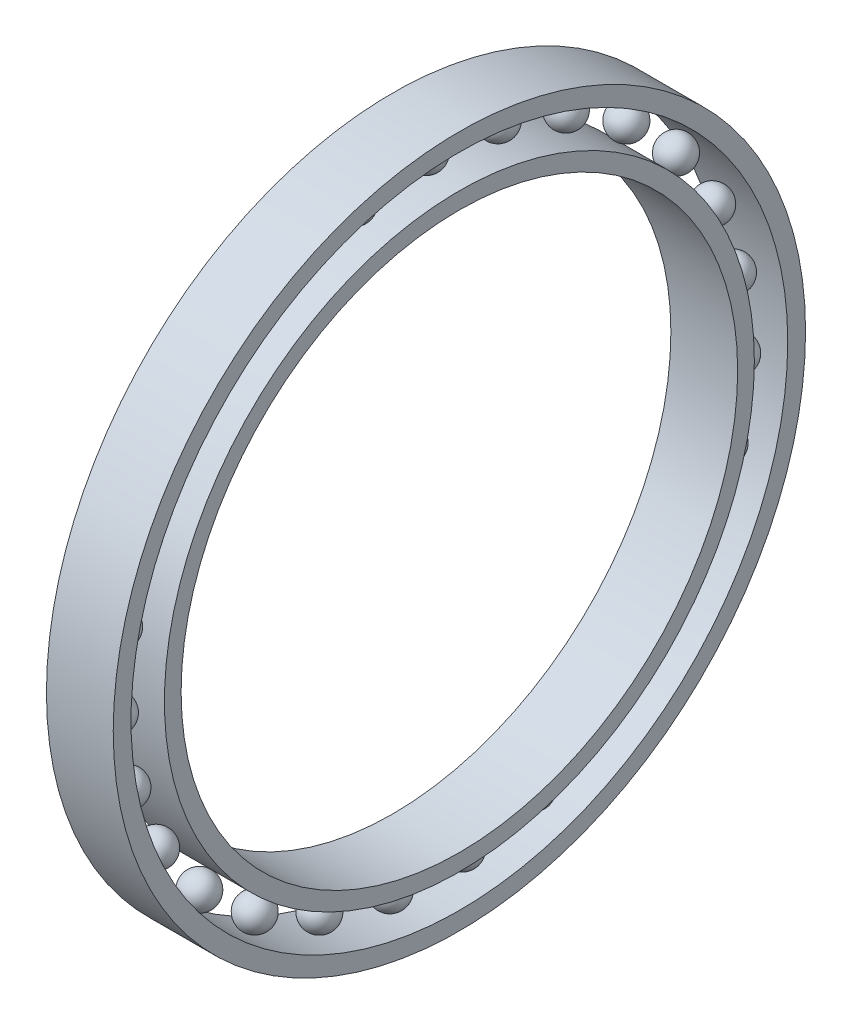
ISO-10303-21;
HEADER;
FILE_DESCRIPTION(('STEP AP214'),'2;1');
FILE_NAME('part.step','',(''),(''),'','','');
FILE_SCHEMA(('AUTOMOTIVE_DESIGN { 1 0 10303 214 1 1 1 1 }'));
ENDSEC;
DATA;
#1=APPLICATION_CONTEXT('core data for automotive mechanical design processes');
#2=APPLICATION_PROTOCOL_DEFINITION('international standard','automotive_design',2000,#1);
#3=PRODUCT_CONTEXT('',#1,'mechanical');
#4=PRODUCT('Part','Part','',(#3));
#5=PRODUCT_RELATED_PRODUCT_CATEGORY('part','',(#4));
#6=PRODUCT_DEFINITION_FORMATION('','',#4);
#7=PRODUCT_DEFINITION_CONTEXT('part definition',#1,'design');
#8=PRODUCT_DEFINITION('design','',#6,#7);
#9=PRODUCT_DEFINITION_SHAPE('','',#8);
#10=(LENGTH_UNIT() NAMED_UNIT(*) SI_UNIT(.MILLI.,.METRE.));
#11=(NAMED_UNIT(*) PLANE_ANGLE_UNIT() SI_UNIT($,.RADIAN.));
#12=(NAMED_UNIT(*) SI_UNIT($,.STERADIAN.) SOLID_ANGLE_UNIT());
#13=UNCERTAINTY_MEASURE_WITH_UNIT(LENGTH_MEASURE(1.E-05),#10,'distance_accuracy_value','');
#14=(GEOMETRIC_REPRESENTATION_CONTEXT(3) GLOBAL_UNCERTAINTY_ASSIGNED_CONTEXT((#13)) GLOBAL_UNIT_ASSIGNED_CONTEXT((#10,
#11,#12)) REPRESENTATION_CONTEXT('',''));
#15=CARTESIAN_POINT('',(0.,0.,0.));
#16=DIRECTION('',(0.,0.,1.));
#17=DIRECTION('',(1.,0.,0.));
#18=AXIS2_PLACEMENT_3D('',#15,#16,#17);
#19=CARTESIAN_POINT('',(0.,27.2452563762352,-6.45724438078795));
#20=DIRECTION('',(0.,-0.973044870579827,0.230615870742427));
#21=DIRECTION('',(0.,0.230615870742427,0.973044870579827));
#22=AXIS2_PLACEMENT_3D('',#19,#20,#21);
#23=SPHERICAL_SURFACE('',#22,1.5);
#24=CARTESIAN_POINT('',(0.,25.7856890703654,-6.11132057467431));
#25=VERTEX_POINT('',#24);
#26=VERTEX_LOOP('',#25);
#27=FACE_BOUND('',#26,.T.);
#28=ADVANCED_FACE('F56',(#27),#23,.T.);
#29=CLOSED_SHELL('',(#28));
#30=MANIFOLD_SOLID_BREP('B2',#29);
#31=CARTESIAN_POINT('',(0.,25.0217139290557,-12.5663770456126));
#32=DIRECTION('',(0.,-0.893632640323418,0.448799180200451));
#33=DIRECTION('',(0.,0.448799180200451,0.893632640323418));
#34=AXIS2_PLACEMENT_3D('',#31,#32,#33);
#35=SPHERICAL_SURFACE('',#34,1.5);
#36=CARTESIAN_POINT('',(0.,23.6812649685706,-11.8931782753119));
#37=VERTEX_POINT('',#36);
#38=VERTEX_LOOP('',#37);
#39=FACE_BOUND('',#38,.T.);
#40=ADVANCED_FACE('F75',(#39),#35,.T.);
#41=CLOSED_SHELL('',(#40));
#42=MANIFOLD_SOLID_BREP('B7',#41);
#43=CARTESIAN_POINT('',(0.,21.4492444073316,-17.9980530712228));
#44=DIRECTION('',(0.,-0.766044443118986,0.642787609686529));
#45=DIRECTION('',(0.,0.642787609686529,0.766044443118986));
#46=AXIS2_PLACEMENT_3D('',#43,#44,#45);
#47=SPHERICAL_SURFACE('',#46,1.5);
#48=CARTESIAN_POINT('',(0.,20.3001777426531,-17.033871656693));
#49=VERTEX_POINT('',#48);
#50=VERTEX_LOOP('',#49);
#51=FACE_BOUND('',#50,.T.);
#52=ADVANCED_FACE('F94',(#51),#47,.T.);
#53=CLOSED_SHELL('',(#52));
#54=MANIFOLD_SOLID_BREP('B52',#53);
#55=CARTESIAN_POINT('',(0.,16.7204405676783,-22.459449397141));
#56=DIRECTION('',(0.,-0.597158591702796,0.802123192755037));
#57=DIRECTION('',(0.,0.802123192755037,0.597158591702796));
#58=AXIS2_PLACEMENT_3D('',#55,#56,#57);
#59=SPHERICAL_SURFACE('',#58,1.5);
#60=CARTESIAN_POINT('',(0.,15.8247026801241,-21.2562646080085));
#61=VERTEX_POINT('',#60);
#62=VERTEX_LOOP('',#61);
#63=FACE_BOUND('',#62,.T.);
#64=ADVANCED_FACE('F113',(#63),#59,.T.);
#65=CLOSED_SHELL('',(#64));
#66=MANIFOLD_SOLID_BREP('B71',#65);
#67=CARTESIAN_POINT('',(0.,11.0902334490967,-25.7100509926476));
#68=DIRECTION('',(0.,-0.396079766039167,0.91821610688027));
#69=DIRECTION('',(0.,0.91821610688027,0.396079766039167));
#70=AXIS2_PLACEMENT_3D('',#67,#68,#69);
#71=SPHERICAL_SURFACE('',#70,1.5);
#72=CARTESIAN_POINT('',(0.,10.4961138000379,-24.3327268323271));
#73=VERTEX_POINT('',#72);
#74=VERTEX_LOOP('',#73);
#75=FACE_BOUND('',#74,.T.);
#76=ADVANCED_FACE('F132',(#75),#71,.T.);
#77=CLOSED_SHELL('',(#76));
#78=MANIFOLD_SOLID_BREP('B90',#77);
#79=CARTESIAN_POINT('',(0.,4.86214897467436,-27.5746170843418));
#80=DIRECTION('',(0.,-0.173648177666941,0.984807753012206));
#81=DIRECTION('',(0.,0.984807753012206,0.173648177666941));
#82=AXIS2_PLACEMENT_3D('',#79,#80,#81);
#83=SPHERICAL_SURFACE('',#82,1.5);
#84=CARTESIAN_POINT('',(0.,4.60167670817395,-26.0974054548235));
#85=VERTEX_POINT('',#84);
#86=VERTEX_LOOP('',#85);
#87=FACE_BOUND('',#86,.T.);
#88=ADVANCED_FACE('F151',(#87),#83,.T.);
#89=CLOSED_SHELL('',(#88));
#90=MANIFOLD_SOLID_BREP('B109',#89);
#91=CARTESIAN_POINT('',(0.,-1.62805520949304,-27.9526284315955));
#92=DIRECTION('',(0.,0.0581448289104656,0.998308158271269));
#93=DIRECTION('',(0.,0.998308158271269,-0.0581448289104656));
#94=AXIS2_PLACEMENT_3D('',#91,#92,#93);
#95=SPHERICAL_SURFACE('',#94,1.5);
#96=CARTESIAN_POINT('',(0.,-1.54083796612734,-26.4551661941886));
#97=VERTEX_POINT('',#96);
#98=VERTEX_LOOP('',#97);
#99=FACE_BOUND('',#98,.T.);
#100=ADVANCED_FACE('F170',(#99),#95,.T.);
#101=CLOSED_SHELL('',(#100));
#102=MANIFOLD_SOLID_BREP('B128',#101);
#103=CARTESIAN_POINT('',(0.,-8.03049051591025,-26.8237063448338));
#104=DIRECTION('',(0.,0.28680323271108,0.957989512315492));
#105=DIRECTION('',(0.,0.957989512315492,-0.28680323271108));
#106=AXIS2_PLACEMENT_3D('',#103,#104,#105);
#107=SPHERICAL_SURFACE('',#106,1.5);
#108=CARTESIAN_POINT('',(0.,-7.60028566684363,-25.3867220763605));
#109=VERTEX_POINT('',#108);
#110=VERTEX_LOOP('',#109);
#111=FACE_BOUND('',#110,.T.);
#112=ADVANCED_FACE('F189',(#111),#107,.T.);
#113=CLOSED_SHELL('',(#112));
#114=MANIFOLD_SOLID_BREP('B147',#113);
#115=CARTESIAN_POINT('',(0.,-13.9999999999998,-24.2487113059644));
#116=DIRECTION('',(0.,0.499999999999992,0.866025403784443));
#117=DIRECTION('',(0.,0.866025403784443,-0.499999999999992));
#118=AXIS2_PLACEMENT_3D('',#115,#116,#117);
#119=SPHERICAL_SURFACE('',#118,1.5);
#120=CARTESIAN_POINT('',(0.,-13.2499999999998,-22.9496732002877));
#121=VERTEX_POINT('',#120);
#122=VERTEX_LOOP('',#121);
#123=FACE_BOUND('',#122,.T.);
#124=ADVANCED_FACE('F208',(#123),#119,.T.);
#125=CLOSED_SHELL('',(#124));
#126=MANIFOLD_SOLID_BREP('B166',#125);
#127=CARTESIAN_POINT('',(0.,-19.2147658603244,-20.3664619640455));
#128=DIRECTION('',(0.,0.686241637868727,0.727373641573055));
#129=DIRECTION('',(0.,0.727373641573055,-0.686241637868727));
#130=AXIS2_PLACEMENT_3D('',#127,#128,#129);
#131=SPHERICAL_SURFACE('',#130,1.5);
#132=CARTESIAN_POINT('',(0.,-18.1854034035213,-19.275401501686));
#133=VERTEX_POINT('',#132);
#134=VERTEX_LOOP('',#133);
#135=FACE_BOUND('',#134,.T.);
#136=ADVANCED_FACE('F227',(#135),#131,.T.);
#137=CLOSED_SHELL('',(#136));
#138=MANIFOLD_SOLID_BREP('B185',#137);
#139=CARTESIAN_POINT('',(0.,-23.3936587195621,-15.3862513859828));
#140=DIRECTION('',(0.,0.835487811412932,0.549508978070813));
#141=DIRECTION('',(0.,0.549508978070813,-0.835487811412932));
#142=AXIS2_PLACEMENT_3D('',#139,#140,#141);
#143=SPHERICAL_SURFACE('',#142,1.5);
#144=CARTESIAN_POINT('',(0.,-22.1404270024427,-14.5619879188765));
#145=VERTEX_POINT('',#144);
#146=VERTEX_LOOP('',#145);
#147=FACE_BOUND('',#146,.T.);
#148=ADVANCED_FACE('F246',(#147),#143,.T.);
#149=CLOSED_SHELL('',(#148));
#150=MANIFOLD_SOLID_BREP('B204',#149);
#151=CARTESIAN_POINT('',(0.,-26.3113933820054,-9.57656401311894));
#152=DIRECTION('',(0.,0.939692620785906,0.342020143325676));
#153=DIRECTION('',(0.,0.342020143325676,-0.939692620785906));
#154=AXIS2_PLACEMENT_3D('',#151,#152,#153);
#155=SPHERICAL_SURFACE('',#154,1.5);
#156=CARTESIAN_POINT('',(0.,-24.9018544508265,-9.06353379813042));
#157=VERTEX_POINT('',#156);
#158=VERTEX_LOOP('',#157);
#159=FACE_BOUND('',#158,.T.);
#160=ADVANCED_FACE('F265',(#159),#155,.T.);
#161=CLOSED_SHELL('',(#160));
#162=MANIFOLD_SOLID_BREP('B223',#161);
#163=CARTESIAN_POINT('',(0.,-27.8106740167744,-3.25060159550665));
#164=DIRECTION('',(0.,0.993238357741942,0.116092914125238));
#165=DIRECTION('',(0.,0.116092914125238,-0.993238357741942));
#166=AXIS2_PLACEMENT_3D('',#163,#164,#165);
#167=SPHERICAL_SURFACE('',#166,1.5);
#168=CARTESIAN_POINT('',(0.,-26.3208164801615,-3.0764622243188));
#169=VERTEX_POINT('',#168);
#170=VERTEX_LOOP('',#169);
#171=FACE_BOUND('',#170,.T.);
#172=ADVANCED_FACE('F284',(#171),#167,.T.);
#173=CLOSED_SHELL('',(#172));
#174=MANIFOLD_SOLID_BREP('B242',#173);
#175=CARTESIAN_POINT('',(0.,-27.8106740167744,3.25060159550625));
#176=DIRECTION('',(0.,0.993238357741944,-0.116092914125223));
#177=DIRECTION('',(0.,-0.116092914125223,-0.993238357741944));
#178=AXIS2_PLACEMENT_3D('',#175,#176,#177);
#179=SPHERICAL_SURFACE('',#178,1.5);
#180=CARTESIAN_POINT('',(0.,-26.3208164801615,3.07646222431842));
#181=VERTEX_POINT('',#180);
#182=VERTEX_LOOP('',#181);
#183=FACE_BOUND('',#182,.T.);
#184=ADVANCED_FACE('F303',(#183),#179,.T.);
#185=CLOSED_SHELL('',(#184));
#186=MANIFOLD_SOLID_BREP('B261',#185);
#187=CARTESIAN_POINT('',(0.,-26.3113933820055,9.57656401311855));
#188=DIRECTION('',(0.,0.939692620785911,-0.342020143325663));
#189=DIRECTION('',(0.,-0.342020143325663,-0.939692620785911));
#190=AXIS2_PLACEMENT_3D('',#187,#188,#189);
#191=SPHERICAL_SURFACE('',#190,1.5);
#192=CARTESIAN_POINT('',(0.,-24.9018544508266,9.06353379813006));
#193=VERTEX_POINT('',#192);
#194=VERTEX_LOOP('',#193);
#195=FACE_BOUND('',#194,.T.);
#196=ADVANCED_FACE('F322',(#195),#191,.T.);
#197=CLOSED_SHELL('',(#196));
#198=MANIFOLD_SOLID_BREP('B280',#197);
#199=CARTESIAN_POINT('',(0.,-23.3936587195623,15.3862513859824));
#200=DIRECTION('',(0.,0.835487811412939,-0.549508978070801));
#201=DIRECTION('',(0.,-0.549508978070801,-0.835487811412939));
#202=AXIS2_PLACEMENT_3D('',#199,#200,#201);
#203=SPHERICAL_SURFACE('',#202,1.5);
#204=CARTESIAN_POINT('',(0.,-22.1404270024429,14.5619879188762));
#205=VERTEX_POINT('',#204);
#206=VERTEX_LOOP('',#205);
#207=FACE_BOUND('',#206,.T.);
#208=ADVANCED_FACE('F341',(#207),#203,.T.);
#209=CLOSED_SHELL('',(#208));
#210=MANIFOLD_SOLID_BREP('B299',#209);
#211=CARTESIAN_POINT('',(0.,-19.2147658603246,20.3664619640453));
#212=DIRECTION('',(0.,0.686241637868737,-0.727373641573045));
#213=DIRECTION('',(0.,-0.727373641573045,-0.686241637868737));
#214=AXIS2_PLACEMENT_3D('',#211,#212,#213);
#215=SPHERICAL_SURFACE('',#214,1.5);
#216=CARTESIAN_POINT('',(0.,-18.1854034035215,19.2754015016857));
#217=VERTEX_POINT('',#216);
#218=VERTEX_LOOP('',#217);
#219=FACE_BOUND('',#218,.T.);
#220=ADVANCED_FACE('F360',(#219),#215,.T.);
#221=CLOSED_SHELL('',(#220));
#222=MANIFOLD_SOLID_BREP('B318',#221);
#223=CARTESIAN_POINT('',(0.,-14.0000000000001,24.2487113059642));
#224=DIRECTION('',(0.,0.500000000000004,-0.866025403784436));
#225=DIRECTION('',(0.,-0.866025403784436,-0.500000000000004));
#226=AXIS2_PLACEMENT_3D('',#223,#224,#225);
#227=SPHERICAL_SURFACE('',#226,1.5);
#228=CARTESIAN_POINT('',(0.,-13.2500000000001,22.9496732002876));
#229=VERTEX_POINT('',#228);
#230=VERTEX_LOOP('',#229);
#231=FACE_BOUND('',#230,.T.);
#232=ADVANCED_FACE('F379',(#231),#227,.T.);
#233=CLOSED_SHELL('',(#232));
#234=MANIFOLD_SOLID_BREP('B337',#233);
#235=CARTESIAN_POINT('',(0.,-8.03049051591064,26.8237063448337));
#236=DIRECTION('',(0.,0.286803232711094,-0.957989512315488));
#237=DIRECTION('',(0.,-0.957989512315488,-0.286803232711094));
#238=AXIS2_PLACEMENT_3D('',#235,#236,#237);
#239=SPHERICAL_SURFACE('',#238,1.5);
#240=CARTESIAN_POINT('',(0.,-7.600285666844,25.3867220763604));
#241=VERTEX_POINT('',#240);
#242=VERTEX_LOOP('',#241);
#243=FACE_BOUND('',#242,.T.);
#244=ADVANCED_FACE('F398',(#243),#239,.T.);
#245=CLOSED_SHELL('',(#244));
#246=MANIFOLD_SOLID_BREP('B356',#245);
#247=CARTESIAN_POINT('',(0.,-1.62805520949343,27.9526284315955));
#248=DIRECTION('',(0.,0.0581448289104796,-0.998308158271268));
#249=DIRECTION('',(0.,-0.998308158271268,-0.0581448289104796));
#250=AXIS2_PLACEMENT_3D('',#247,#248,#249);
#251=SPHERICAL_SURFACE('',#250,1.5);
#252=CARTESIAN_POINT('',(0.,-1.54083796612771,26.4551661941886));
#253=VERTEX_POINT('',#252);
#254=VERTEX_LOOP('',#253);
#255=FACE_BOUND('',#254,.T.);
#256=ADVANCED_FACE('F417',(#255),#251,.T.);
#257=CLOSED_SHELL('',(#256));
#258=MANIFOLD_SOLID_BREP('B375',#257);
#259=CARTESIAN_POINT('',(0.,4.86214897467396,27.5746170843418));
#260=DIRECTION('',(0.,-0.173648177666927,-0.984807753012209));
#261=DIRECTION('',(0.,-0.984807753012209,0.173648177666927));
#262=AXIS2_PLACEMENT_3D('',#259,#260,#261);
#263=SPHERICAL_SURFACE('',#262,1.5);
#264=CARTESIAN_POINT('',(0.,4.60167670817357,26.0974054548235));
#265=VERTEX_POINT('',#264);
#266=VERTEX_LOOP('',#265);
#267=FACE_BOUND('',#266,.T.);
#268=ADVANCED_FACE('F436',(#267),#263,.T.);
#269=CLOSED_SHELL('',(#268));
#270=MANIFOLD_SOLID_BREP('B394',#269);
#271=CARTESIAN_POINT('',(0.,11.0902334490963,25.7100509926477));
#272=DIRECTION('',(0.,-0.396079766039154,-0.918216106880275));
#273=DIRECTION('',(0.,-0.918216106880275,0.396079766039154));
#274=AXIS2_PLACEMENT_3D('',#271,#272,#273);
#275=SPHERICAL_SURFACE('',#274,1.5);
#276=CARTESIAN_POINT('',(0.,10.4961138000376,24.3327268323273));
#277=VERTEX_POINT('',#276);
#278=VERTEX_LOOP('',#277);
#279=FACE_BOUND('',#278,.T.);
#280=ADVANCED_FACE('F455',(#279),#275,.T.);
#281=CLOSED_SHELL('',(#280));
#282=MANIFOLD_SOLID_BREP('B413',#281);
#283=CARTESIAN_POINT('',(0.,16.720440567678,22.4594493971413));
#284=DIRECTION('',(0.,-0.597158591702785,-0.802123192755045));
#285=DIRECTION('',(0.,-0.802123192755045,0.597158591702785));
#286=AXIS2_PLACEMENT_3D('',#283,#284,#285);
#287=SPHERICAL_SURFACE('',#286,1.5);
#288=CARTESIAN_POINT('',(0.,15.8247026801238,21.2562646080087));
#289=VERTEX_POINT('',#288);
#290=VERTEX_LOOP('',#289);
#291=FACE_BOUND('',#290,.T.);
#292=ADVANCED_FACE('F474',(#291),#287,.T.);
#293=CLOSED_SHELL('',(#292));
#294=MANIFOLD_SOLID_BREP('B432',#293);
#295=CARTESIAN_POINT('',(0.,21.4492444073314,17.9980530712231));
#296=DIRECTION('',(0.,-0.766044443118977,-0.642787609686541));
#297=DIRECTION('',(0.,-0.642787609686541,0.766044443118977));
#298=AXIS2_PLACEMENT_3D('',#295,#296,#297);
#299=SPHERICAL_SURFACE('',#298,1.5);
#300=CARTESIAN_POINT('',(0.,20.3001777426529,17.0338716566933));
#301=VERTEX_POINT('',#300);
#302=VERTEX_LOOP('',#301);
#303=FACE_BOUND('',#302,.T.);
#304=ADVANCED_FACE('F493',(#303),#299,.T.);
#305=CLOSED_SHELL('',(#304));
#306=MANIFOLD_SOLID_BREP('B451',#305);
#307=CARTESIAN_POINT('',(0.,25.0217139290555,12.566377045613));
#308=DIRECTION('',(0.,-0.893632640323412,-0.448799180200463));
#309=DIRECTION('',(0.,-0.448799180200463,0.893632640323412));
#310=AXIS2_PLACEMENT_3D('',#307,#308,#309);
#311=SPHERICAL_SURFACE('',#310,1.5);
#312=CARTESIAN_POINT('',(0.,23.6812649685704,11.8931782753123));
#313=VERTEX_POINT('',#312);
#314=VERTEX_LOOP('',#313);
#315=FACE_BOUND('',#314,.T.);
#316=ADVANCED_FACE('F512',(#315),#311,.T.);
#317=CLOSED_SHELL('',(#316));
#318=MANIFOLD_SOLID_BREP('B470',#317);
#319=CARTESIAN_POINT('',(0.,27.2452563762351,6.45724438078834));
#320=DIRECTION('',(0.,-0.973044870579824,-0.230615870742441));
#321=DIRECTION('',(0.,-0.230615870742441,0.973044870579824));
#322=AXIS2_PLACEMENT_3D('',#319,#320,#321);
#323=SPHERICAL_SURFACE('',#322,1.5);
#324=CARTESIAN_POINT('',(0.,25.7856890703653,6.11132057467468));
#325=VERTEX_POINT('',#324);
#326=VERTEX_LOOP('',#325);
#327=FACE_BOUND('',#326,.T.);
#328=ADVANCED_FACE('F531',(#327),#323,.T.);
#329=CLOSED_SHELL('',(#328));
#330=MANIFOLD_SOLID_BREP('B489',#329);
#331=CARTESIAN_POINT('',(0.,28.,0.));
#332=DIRECTION('',(0.,-1.,0.));
#333=DIRECTION('',(0.,0.,1.));
#334=AXIS2_PLACEMENT_3D('',#331,#332,#333);
#335=SPHERICAL_SURFACE('',#334,1.5);
#336=CARTESIAN_POINT('',(0.,26.5,0.));
#337=VERTEX_POINT('',#336);
#338=VERTEX_LOOP('',#337);
#339=FACE_BOUND('',#338,.T.);
#340=ADVANCED_FACE('F552',(#339),#335,.T.);
#341=CLOSED_SHELL('',(#340));
#342=MANIFOLD_SOLID_BREP('B508',#341);
#343=CARTESIAN_POINT('',(-3.,0.,0.));
#344=DIRECTION('',(1.,0.,0.));
#345=DIRECTION('',(0.,0.,-1.));
#346=AXIS2_PLACEMENT_3D('',#343,#344,#345);
#347=CYLINDRICAL_SURFACE('',#346,29.5);
#348=CARTESIAN_POINT('',(-3.,0.,0.));
#349=DIRECTION('',(1.,0.,0.));
#350=DIRECTION('',(0.,0.,-1.));
#351=AXIS2_PLACEMENT_3D('',#348,#349,#350);
#352=CIRCLE('',#351,29.5);
#353=CARTESIAN_POINT('',(-3.,0.,-29.5));
#354=VERTEX_POINT('',#353);
#355=EDGE_CURVE('E579',#354,#354,#352,.T.);
#356=ORIENTED_EDGE('',*,*,#355,.F.);
#357=EDGE_LOOP('',(#356));
#358=FACE_BOUND('',#357,.T.);
#359=CARTESIAN_POINT('',(3.,0.,0.));
#360=DIRECTION('',(1.,0.,0.));
#361=DIRECTION('',(0.,0.,-1.));
#362=AXIS2_PLACEMENT_3D('',#359,#360,#361);
#363=CIRCLE('',#362,29.5);
#364=CARTESIAN_POINT('',(3.,0.,-29.5));
#365=VERTEX_POINT('',#364);
#366=EDGE_CURVE('E589',#365,#365,#363,.T.);
#367=ORIENTED_EDGE('',*,*,#366,.T.);
#368=EDGE_LOOP('',(#367));
#369=FACE_BOUND('',#368,.T.);
#370=ADVANCED_FACE('F572',(#358,#369),#347,.F.);
#371=CARTESIAN_POINT('',(-3.,0.,0.));
#372=DIRECTION('',(1.,0.,0.));
#373=DIRECTION('',(0.,0.,-1.));
#374=AXIS2_PLACEMENT_3D('',#371,#372,#373);
#375=CYLINDRICAL_SURFACE('',#374,31.1);
#376=CARTESIAN_POINT('',(-3.,0.,0.));
#377=DIRECTION('',(1.,0.,0.));
#378=DIRECTION('',(0.,0.,-1.));
#379=AXIS2_PLACEMENT_3D('',#376,#377,#378);
#380=CIRCLE('',#379,31.1);
#381=CARTESIAN_POINT('',(-3.,0.,-31.1));
#382=VERTEX_POINT('',#381);
#383=EDGE_CURVE('E551',#382,#382,#380,.T.);
#384=ORIENTED_EDGE('',*,*,#383,.T.);
#385=EDGE_LOOP('',(#384));
#386=FACE_BOUND('',#385,.T.);
#387=CARTESIAN_POINT('',(3.,0.,0.));
#388=DIRECTION('',(1.,0.,0.));
#389=DIRECTION('',(0.,0.,-1.));
#390=AXIS2_PLACEMENT_3D('',#387,#388,#389);
#391=CIRCLE('',#390,31.1);
#392=CARTESIAN_POINT('',(3.,0.,-31.1));
#393=VERTEX_POINT('',#392);
#394=EDGE_CURVE('E584',#393,#393,#391,.T.);
#395=ORIENTED_EDGE('',*,*,#394,.F.);
#396=EDGE_LOOP('',(#395));
#397=FACE_BOUND('',#396,.T.);
#398=ADVANCED_FACE('F604',(#386,#397),#375,.T.);
#399=CARTESIAN_POINT('',(-3.,0.,0.));
#400=DIRECTION('',(1.,0.,0.));
#401=DIRECTION('',(0.,0.,-1.));
#402=AXIS2_PLACEMENT_3D('',#399,#400,#401);
#403=PLANE('',#402);
#404=ORIENTED_EDGE('',*,*,#355,.T.);
#405=EDGE_LOOP('',(#404));
#406=FACE_BOUND('',#405,.T.);
#407=ORIENTED_EDGE('',*,*,#383,.F.);
#408=EDGE_LOOP('',(#407));
#409=FACE_BOUND('',#408,.T.);
#410=ADVANCED_FACE('F600',(#406,#409),#403,.F.);
#411=CARTESIAN_POINT('',(3.,0.,0.));
#412=DIRECTION('',(1.,0.,0.));
#413=DIRECTION('',(0.,0.,-1.));
#414=AXIS2_PLACEMENT_3D('',#411,#412,#413);
#415=PLANE('',#414);
#416=ORIENTED_EDGE('',*,*,#366,.F.);
#417=EDGE_LOOP('',(#416));
#418=FACE_BOUND('',#417,.T.);
#419=ORIENTED_EDGE('',*,*,#394,.T.);
#420=EDGE_LOOP('',(#419));
#421=FACE_BOUND('',#420,.T.);
#422=ADVANCED_FACE('F597',(#418,#421),#415,.T.);
#423=CLOSED_SHELL('',(#370,#398,#410,#422));
#424=MANIFOLD_SOLID_BREP('B527',#423);
#425=CARTESIAN_POINT('',(-3.,0.,0.));
#426=DIRECTION('',(1.,0.,0.));
#427=DIRECTION('',(0.,0.,-1.));
#428=AXIS2_PLACEMENT_3D('',#425,#426,#427);
#429=CYLINDRICAL_SURFACE('',#428,25.);
#430=CARTESIAN_POINT('',(-3.,0.,0.));
#431=DIRECTION('',(1.,0.,0.));
#432=DIRECTION('',(0.,0.,-1.));
#433=AXIS2_PLACEMENT_3D('',#430,#431,#432);
#434=CIRCLE('',#433,25.);
#435=CARTESIAN_POINT('',(-3.,0.,-25.));
#436=VERTEX_POINT('',#435);
#437=EDGE_CURVE('E644',#436,#436,#434,.T.);
#438=ORIENTED_EDGE('',*,*,#437,.F.);
#439=EDGE_LOOP('',(#438));
#440=FACE_BOUND('',#439,.T.);
#441=CARTESIAN_POINT('',(3.,0.,0.));
#442=DIRECTION('',(1.,0.,0.));
#443=DIRECTION('',(0.,0.,-1.));
#444=AXIS2_PLACEMENT_3D('',#441,#442,#443);
#445=CIRCLE('',#444,25.);
#446=CARTESIAN_POINT('',(3.,0.,-25.));
#447=VERTEX_POINT('',#446);
#448=EDGE_CURVE('E652',#447,#447,#445,.T.);
#449=ORIENTED_EDGE('',*,*,#448,.T.);
#450=EDGE_LOOP('',(#449));
#451=FACE_BOUND('',#450,.T.);
#452=ADVANCED_FACE('F638',(#440,#451),#429,.F.);
#453=CARTESIAN_POINT('',(-3.,0.,0.));
#454=DIRECTION('',(1.,0.,0.));
#455=DIRECTION('',(0.,0.,-1.));
#456=AXIS2_PLACEMENT_3D('',#453,#454,#455);
#457=CYLINDRICAL_SURFACE('',#456,26.5);
#458=CARTESIAN_POINT('',(-3.,0.,0.));
#459=DIRECTION('',(1.,0.,0.));
#460=DIRECTION('',(0.,0.,-1.));
#461=AXIS2_PLACEMENT_3D('',#458,#459,#460);
#462=CIRCLE('',#461,26.5);
#463=CARTESIAN_POINT('',(-3.,0.,-26.5));
#464=VERTEX_POINT('',#463);
#465=EDGE_CURVE('E571',#464,#464,#462,.T.);
#466=ORIENTED_EDGE('',*,*,#465,.T.);
#467=EDGE_LOOP('',(#466));
#468=FACE_BOUND('',#467,.T.);
#469=CARTESIAN_POINT('',(3.,0.,0.));
#470=DIRECTION('',(1.,0.,0.));
#471=DIRECTION('',(0.,0.,-1.));
#472=AXIS2_PLACEMENT_3D('',#469,#470,#471);
#473=CIRCLE('',#472,26.5);
#474=CARTESIAN_POINT('',(3.,0.,-26.5));
#475=VERTEX_POINT('',#474);
#476=EDGE_CURVE('E648',#475,#475,#473,.T.);
#477=ORIENTED_EDGE('',*,*,#476,.F.);
#478=EDGE_LOOP('',(#477));
#479=FACE_BOUND('',#478,.T.);
#480=ADVANCED_FACE('F666',(#468,#479),#457,.T.);
#481=CARTESIAN_POINT('',(-3.,0.,0.));
#482=DIRECTION('',(1.,0.,0.));
#483=DIRECTION('',(0.,0.,-1.));
#484=AXIS2_PLACEMENT_3D('',#481,#482,#483);
#485=PLANE('',#484);
#486=ORIENTED_EDGE('',*,*,#437,.T.);
#487=EDGE_LOOP('',(#486));
#488=FACE_BOUND('',#487,.T.);
#489=ORIENTED_EDGE('',*,*,#465,.F.);
#490=EDGE_LOOP('',(#489));
#491=FACE_BOUND('',#490,.T.);
#492=ADVANCED_FACE('F662',(#488,#491),#485,.F.);
#493=CARTESIAN_POINT('',(3.,0.,0.));
#494=DIRECTION('',(1.,0.,0.));
#495=DIRECTION('',(0.,0.,-1.));
#496=AXIS2_PLACEMENT_3D('',#493,#494,#495);
#497=PLANE('',#496);
#498=ORIENTED_EDGE('',*,*,#448,.F.);
#499=EDGE_LOOP('',(#498));
#500=FACE_BOUND('',#499,.T.);
#501=ORIENTED_EDGE('',*,*,#476,.T.);
#502=EDGE_LOOP('',(#501));
#503=FACE_BOUND('',#502,.T.);
#504=ADVANCED_FACE('F659',(#500,#503),#497,.T.);
#505=CLOSED_SHELL('',(#452,#480,#492,#504));
#506=MANIFOLD_SOLID_BREP('B546',#505);
#507=ADVANCED_BREP_SHAPE_REPRESENTATION('',(#18,#30,#42,#54,#66,#78,#90,#102,#114,#126,#138,
#150,#162,#174,#186,#198,#210,#222,#234,#246,#258,#270,#282,#294,#306,#318,#330,#342,#424,#506),#14);
#508=SHAPE_DEFINITION_REPRESENTATION(#9,#507);
ENDSEC;
END-ISO-10303-21;
